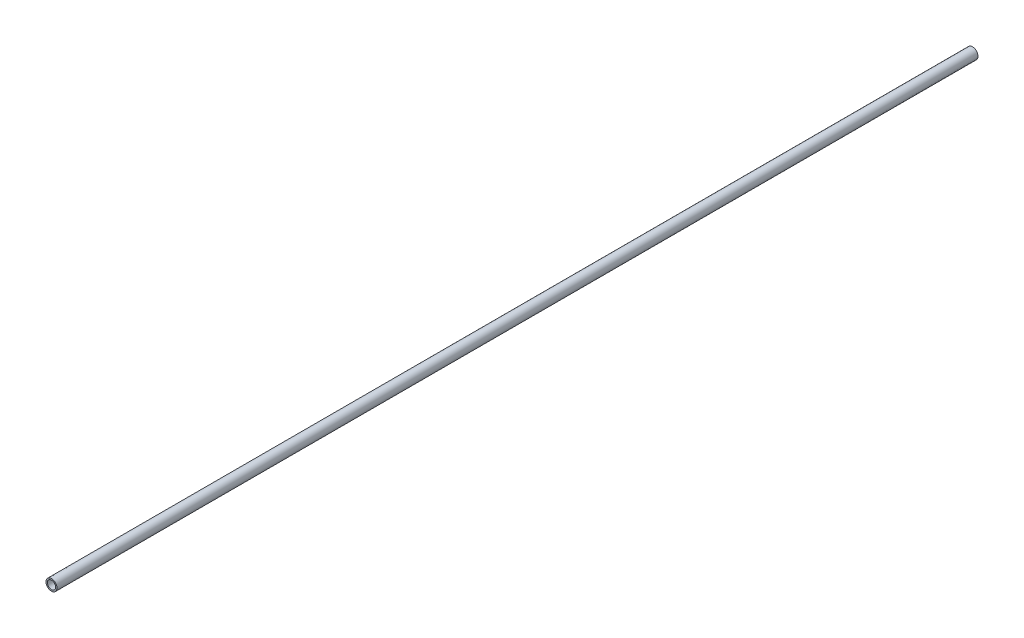
ISO-10303-21;
HEADER;
FILE_DESCRIPTION(('STEP AP214'),'2;1');
FILE_NAME('part.step','',(''),(''),'','','');
FILE_SCHEMA(('AUTOMOTIVE_DESIGN { 1 0 10303 214 1 1 1 1 }'));
ENDSEC;
DATA;
#1=APPLICATION_CONTEXT('core data for automotive mechanical design processes');
#2=APPLICATION_PROTOCOL_DEFINITION('international standard','automotive_design',2000,#1);
#3=PRODUCT_CONTEXT('',#1,'mechanical');
#4=PRODUCT('Part','Part','',(#3));
#5=PRODUCT_RELATED_PRODUCT_CATEGORY('part','',(#4));
#6=PRODUCT_DEFINITION_FORMATION('','',#4);
#7=PRODUCT_DEFINITION_CONTEXT('part definition',#1,'design');
#8=PRODUCT_DEFINITION('design','',#6,#7);
#9=PRODUCT_DEFINITION_SHAPE('','',#8);
#10=(LENGTH_UNIT() NAMED_UNIT(*) SI_UNIT(.MILLI.,.METRE.));
#11=(NAMED_UNIT(*) PLANE_ANGLE_UNIT() SI_UNIT($,.RADIAN.));
#12=(NAMED_UNIT(*) SI_UNIT($,.STERADIAN.) SOLID_ANGLE_UNIT());
#13=UNCERTAINTY_MEASURE_WITH_UNIT(LENGTH_MEASURE(1.E-05),#10,'distance_accuracy_value','');
#14=(GEOMETRIC_REPRESENTATION_CONTEXT(3) GLOBAL_UNCERTAINTY_ASSIGNED_CONTEXT((#13)) GLOBAL_UNIT_ASSIGNED_CONTEXT((#10,
#11,#12)) REPRESENTATION_CONTEXT('',''));
#15=CARTESIAN_POINT('',(0.,0.,0.));
#16=DIRECTION('',(0.,0.,1.));
#17=DIRECTION('',(1.,0.,0.));
#18=AXIS2_PLACEMENT_3D('',#15,#16,#17);
#19=CARTESIAN_POINT('',(0.,0.,533.4));
#20=DIRECTION('',(0.,0.,1.));
#21=DIRECTION('',(1.,0.,0.));
#22=AXIS2_PLACEMENT_3D('',#19,#20,#21);
#23=PLANE('',#22);
#24=CARTESIAN_POINT('',(0.,0.,533.4));
#25=DIRECTION('',(0.,0.,1.));
#26=DIRECTION('',(1.,0.,0.));
#27=AXIS2_PLACEMENT_3D('',#24,#25,#26);
#28=CIRCLE('',#27,6.35);
#29=CARTESIAN_POINT('',(6.35,0.,533.4));
#30=VERTEX_POINT('',#29);
#31=EDGE_CURVE('E10',#30,#30,#28,.T.);
#32=ORIENTED_EDGE('',*,*,#31,.T.);
#33=EDGE_LOOP('',(#32));
#34=FACE_BOUND('',#33,.T.);
#35=CARTESIAN_POINT('',(0.,0.,533.4));
#36=DIRECTION('',(0.,0.,1.));
#37=DIRECTION('',(1.,0.,0.));
#38=AXIS2_PLACEMENT_3D('',#35,#36,#37);
#39=CIRCLE('',#38,4.7625);
#40=CARTESIAN_POINT('',(4.7625,0.,533.4));
#41=VERTEX_POINT('',#40);
#42=EDGE_CURVE('E43',#41,#41,#39,.T.);
#43=ORIENTED_EDGE('',*,*,#42,.F.);
#44=EDGE_LOOP('',(#43));
#45=FACE_BOUND('',#44,.T.);
#46=ADVANCED_FACE('F32',(#34,#45),#23,.T.);
#47=CARTESIAN_POINT('',(0.,0.,-533.4));
#48=DIRECTION('',(0.,0.,1.));
#49=DIRECTION('',(1.,0.,0.));
#50=AXIS2_PLACEMENT_3D('',#47,#48,#49);
#51=PLANE('',#50);
#52=CARTESIAN_POINT('',(0.,0.,-533.4));
#53=DIRECTION('',(0.,0.,1.));
#54=DIRECTION('',(1.,0.,0.));
#55=AXIS2_PLACEMENT_3D('',#52,#53,#54);
#56=CIRCLE('',#55,6.35);
#57=CARTESIAN_POINT('',(6.35,0.,-533.4));
#58=VERTEX_POINT('',#57);
#59=EDGE_CURVE('E36',#58,#58,#56,.T.);
#60=ORIENTED_EDGE('',*,*,#59,.F.);
#61=EDGE_LOOP('',(#60));
#62=FACE_BOUND('',#61,.T.);
#63=CARTESIAN_POINT('',(0.,0.,-533.4));
#64=DIRECTION('',(0.,0.,1.));
#65=DIRECTION('',(1.,0.,0.));
#66=AXIS2_PLACEMENT_3D('',#63,#64,#65);
#67=CIRCLE('',#66,4.7625);
#68=CARTESIAN_POINT('',(4.7625,0.,-533.4));
#69=VERTEX_POINT('',#68);
#70=EDGE_CURVE('E45',#69,#69,#67,.T.);
#71=ORIENTED_EDGE('',*,*,#70,.T.);
#72=EDGE_LOOP('',(#71));
#73=FACE_BOUND('',#72,.T.);
#74=ADVANCED_FACE('F55',(#62,#73),#51,.F.);
#75=CARTESIAN_POINT('',(0.,0.,533.4));
#76=DIRECTION('',(0.,0.,-1.));
#77=DIRECTION('',(-1.,0.,0.));
#78=AXIS2_PLACEMENT_3D('',#75,#76,#77);
#79=CYLINDRICAL_SURFACE('',#78,6.35);
#80=ORIENTED_EDGE('',*,*,#31,.F.);
#81=EDGE_LOOP('',(#80));
#82=FACE_BOUND('',#81,.T.);
#83=ORIENTED_EDGE('',*,*,#59,.T.);
#84=EDGE_LOOP('',(#83));
#85=FACE_BOUND('',#84,.T.);
#86=ADVANCED_FACE('F34',(#82,#85),#79,.T.);
#87=CARTESIAN_POINT('',(0.,0.,533.4));
#88=DIRECTION('',(0.,0.,-1.));
#89=DIRECTION('',(-1.,0.,0.));
#90=AXIS2_PLACEMENT_3D('',#87,#88,#89);
#91=CYLINDRICAL_SURFACE('',#90,4.7625);
#92=ORIENTED_EDGE('',*,*,#42,.T.);
#93=EDGE_LOOP('',(#92));
#94=FACE_BOUND('',#93,.T.);
#95=ORIENTED_EDGE('',*,*,#70,.F.);
#96=EDGE_LOOP('',(#95));
#97=FACE_BOUND('',#96,.T.);
#98=ADVANCED_FACE('F51',(#94,#97),#91,.F.);
#99=CLOSED_SHELL('',(#46,#74,#86,#98));
#100=MANIFOLD_SOLID_BREP('B2',#99);
#101=ADVANCED_BREP_SHAPE_REPRESENTATION('',(#18,#100),#14);
#102=SHAPE_DEFINITION_REPRESENTATION(#9,#101);
ENDSEC;
END-ISO-10303-21;
